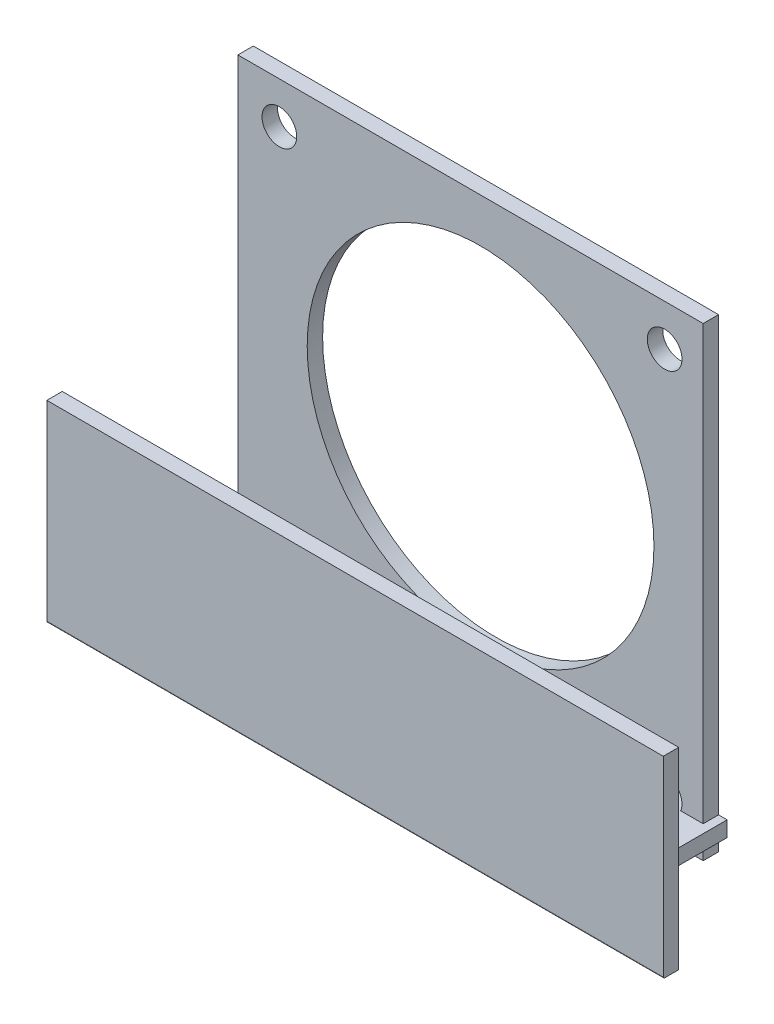
ISO-10303-21;
HEADER;
FILE_DESCRIPTION(('STEP AP214'),'2;1');
FILE_NAME('part.step','',(''),(''),'','','');
FILE_SCHEMA(('AUTOMOTIVE_DESIGN { 1 0 10303 214 1 1 1 1 }'));
ENDSEC;
DATA;
#1=APPLICATION_CONTEXT('core data for automotive mechanical design processes');
#2=APPLICATION_PROTOCOL_DEFINITION('international standard','automotive_design',2000,#1);
#3=PRODUCT_CONTEXT('',#1,'mechanical');
#4=PRODUCT('Part','Part','',(#3));
#5=PRODUCT_RELATED_PRODUCT_CATEGORY('part','',(#4));
#6=PRODUCT_DEFINITION_FORMATION('','',#4);
#7=PRODUCT_DEFINITION_CONTEXT('part definition',#1,'design');
#8=PRODUCT_DEFINITION('design','',#6,#7);
#9=PRODUCT_DEFINITION_SHAPE('','',#8);
#10=(LENGTH_UNIT() NAMED_UNIT(*) SI_UNIT(.MILLI.,.METRE.));
#11=(NAMED_UNIT(*) PLANE_ANGLE_UNIT() SI_UNIT($,.RADIAN.));
#12=(NAMED_UNIT(*) SI_UNIT($,.STERADIAN.) SOLID_ANGLE_UNIT());
#13=UNCERTAINTY_MEASURE_WITH_UNIT(LENGTH_MEASURE(1.E-05),#10,'distance_accuracy_value','');
#14=(GEOMETRIC_REPRESENTATION_CONTEXT(3) GLOBAL_UNCERTAINTY_ASSIGNED_CONTEXT((#13)) GLOBAL_UNIT_ASSIGNED_CONTEXT((#10,
#11,#12)) REPRESENTATION_CONTEXT('',''));
#15=CARTESIAN_POINT('',(0.,0.,0.));
#16=DIRECTION('',(0.,0.,1.));
#17=DIRECTION('',(1.,0.,0.));
#18=AXIS2_PLACEMENT_3D('',#15,#16,#17);
#19=CARTESIAN_POINT('',(4.97470104017416E-13,1.15730236722078E-12,18.0000000000003));
#20=DIRECTION('',(0.,0.,-1.));
#21=DIRECTION('',(0.,1.,0.));
#22=AXIS2_PLACEMENT_3D('',#19,#20,#21);
#23=PLANE('',#22);
#24=DIRECTION('',(0.,-1.,0.));
#25=VECTOR('',#24,1.);
#26=CARTESIAN_POINT('',(-38.2880449468926,-5.00000000000001,18.0000000000006));
#27=LINE('',#26,#25);
#28=CARTESIAN_POINT('',(-38.2880449468926,-5.00000000000001,18.0000000000006));
#29=VERTEX_POINT('',#28);
#30=CARTESIAN_POINT('',(-38.2880449468926,-30.,18.));
#31=VERTEX_POINT('',#30);
#32=EDGE_CURVE('E95',#29,#31,#27,.T.);
#33=ORIENTED_EDGE('',*,*,#32,.F.);
#34=DIRECTION('',(-1.,0.,0.));
#35=VECTOR('',#34,1.);
#36=CARTESIAN_POINT('',(41.7119550531074,-5.00000000000001,17.9999999999998));
#37=LINE('',#36,#35);
#38=CARTESIAN_POINT('',(41.7119550531074,-5.00000000000001,17.9999999999998));
#39=VERTEX_POINT('',#38);
#40=EDGE_CURVE('E114',#39,#29,#37,.T.);
#41=ORIENTED_EDGE('',*,*,#40,.F.);
#42=DIRECTION('',(0.,-1.,0.));
#43=VECTOR('',#42,1.);
#44=CARTESIAN_POINT('',(41.7119550531074,-5.00000000000001,17.9999999999998));
#45=LINE('',#44,#43);
#46=CARTESIAN_POINT('',(41.7119550531074,-30.,18.));
#47=VERTEX_POINT('',#46);
#48=EDGE_CURVE('E121',#39,#47,#45,.T.);
#49=ORIENTED_EDGE('',*,*,#48,.T.);
#50=DIRECTION('',(1.,0.,0.));
#51=VECTOR('',#50,1.);
#52=CARTESIAN_POINT('',(-38.2880449468926,-30.,18.));
#53=LINE('',#52,#51);
#54=EDGE_CURVE('E153',#31,#47,#53,.T.);
#55=ORIENTED_EDGE('',*,*,#54,.F.);
#56=EDGE_LOOP('',(#33,#41,#49,#55));
#57=FACE_BOUND('',#56,.T.);
#58=ADVANCED_FACE('F84',(#57),#23,.T.);
#59=CARTESIAN_POINT('',(4.97470104017416E-13,1.15730236722078E-12,20.0000000000003));
#60=DIRECTION('',(0.,0.,-1.));
#61=DIRECTION('',(0.,1.,0.));
#62=AXIS2_PLACEMENT_3D('',#59,#60,#61);
#63=PLANE('',#62);
#64=DIRECTION('',(0.,-1.,0.));
#65=VECTOR('',#64,1.);
#66=CARTESIAN_POINT('',(-38.2880449468926,-5.00000000000001,20.0000000000006));
#67=LINE('',#66,#65);
#68=CARTESIAN_POINT('',(-38.2880449468926,-5.00000000000001,20.0000000000006));
#69=VERTEX_POINT('',#68);
#70=CARTESIAN_POINT('',(-38.2880449468926,-29.8,20.0000000000022));
#71=VERTEX_POINT('',#70);
#72=EDGE_CURVE('E13',#69,#71,#67,.T.);
#73=ORIENTED_EDGE('',*,*,#72,.T.);
#74=DIRECTION('',(1.,0.,0.));
#75=VECTOR('',#74,1.);
#76=CARTESIAN_POINT('',(-38.2880449468926,-29.8,20.0000000000022));
#77=LINE('',#76,#75);
#78=CARTESIAN_POINT('',(41.7119550531074,-29.8,20.0000000000022));
#79=VERTEX_POINT('',#78);
#80=EDGE_CURVE('E148',#71,#79,#77,.T.);
#81=ORIENTED_EDGE('',*,*,#80,.T.);
#82=DIRECTION('',(0.,-1.,0.));
#83=VECTOR('',#82,1.);
#84=CARTESIAN_POINT('',(41.7119550531074,-5.00000000000001,19.9999999999998));
#85=LINE('',#84,#83);
#86=CARTESIAN_POINT('',(41.7119550531074,-5.00000000000001,19.9999999999998));
#87=VERTEX_POINT('',#86);
#88=EDGE_CURVE('E179',#87,#79,#85,.T.);
#89=ORIENTED_EDGE('',*,*,#88,.F.);
#90=DIRECTION('',(-1.,0.,0.));
#91=VECTOR('',#90,1.);
#92=CARTESIAN_POINT('',(41.7119550531074,-5.00000000000001,19.9999999999998));
#93=LINE('',#92,#91);
#94=EDGE_CURVE('E167',#87,#69,#93,.T.);
#95=ORIENTED_EDGE('',*,*,#94,.T.);
#96=EDGE_LOOP('',(#73,#81,#89,#95));
#97=FACE_BOUND('',#96,.T.);
#98=ADVANCED_FACE('F214',(#97),#63,.F.);
#99=CARTESIAN_POINT('',(41.7119550531074,-5.00000000000001,19.9999999999998));
#100=DIRECTION('',(0.,-1.,0.));
#101=DIRECTION('',(0.,0.,-1.));
#102=AXIS2_PLACEMENT_3D('',#99,#100,#101);
#103=PLANE('',#102);
#104=ORIENTED_EDGE('',*,*,#40,.T.);
#105=DIRECTION('',(0.,0.,-1.));
#106=VECTOR('',#105,1.);
#107=CARTESIAN_POINT('',(-38.2880449468926,-5.00000000000001,20.0000000000006));
#108=LINE('',#107,#106);
#109=EDGE_CURVE('E145',#69,#29,#108,.T.);
#110=ORIENTED_EDGE('',*,*,#109,.F.);
#111=ORIENTED_EDGE('',*,*,#94,.F.);
#112=DIRECTION('',(0.,0.,-1.));
#113=VECTOR('',#112,1.);
#114=CARTESIAN_POINT('',(41.7119550531074,-5.00000000000001,19.9999999999998));
#115=LINE('',#114,#113);
#116=EDGE_CURVE('E172',#87,#39,#115,.T.);
#117=ORIENTED_EDGE('',*,*,#116,.T.);
#118=EDGE_LOOP('',(#104,#110,#111,#117));
#119=FACE_BOUND('',#118,.T.);
#120=ADVANCED_FACE('F210',(#119),#103,.F.);
#121=CARTESIAN_POINT('',(-38.2880449468926,-5.00000000000001,20.0000000000006));
#122=DIRECTION('',(1.,0.,0.));
#123=DIRECTION('',(0.,1.,0.));
#124=AXIS2_PLACEMENT_3D('',#121,#122,#123);
#125=PLANE('',#124);
#126=ORIENTED_EDGE('',*,*,#32,.T.);
#127=DIRECTION('',(0.,0.,1.));
#128=VECTOR('',#127,1.);
#129=CARTESIAN_POINT('',(-38.2880449468926,-30.,20.0000000000006));
#130=LINE('',#129,#128);
#131=CARTESIAN_POINT('',(-38.2880449468926,-30.,19.8000000000005));
#132=VERTEX_POINT('',#131);
#133=EDGE_CURVE('E144',#31,#132,#130,.T.);
#134=ORIENTED_EDGE('',*,*,#133,.T.);
#135=CARTESIAN_POINT('',(-38.2880449468926,-29.8,19.8000000000022));
#136=DIRECTION('',(1.,0.,0.));
#137=DIRECTION('',(0.,0.,1.));
#138=AXIS2_PLACEMENT_3D('',#135,#136,#137);
#139=CIRCLE('',#138,0.200000000000006);
#140=EDGE_CURVE('E128',#71,#132,#139,.T.);
#141=ORIENTED_EDGE('',*,*,#140,.F.);
#142=ORIENTED_EDGE('',*,*,#72,.F.);
#143=ORIENTED_EDGE('',*,*,#109,.T.);
#144=EDGE_LOOP('',(#126,#134,#141,#142,#143));
#145=FACE_BOUND('',#144,.T.);
#146=ADVANCED_FACE('F143',(#145),#125,.F.);
#147=CARTESIAN_POINT('',(41.7119550531074,-5.00000000000001,19.9999999999998));
#148=DIRECTION('',(1.,0.,0.));
#149=DIRECTION('',(0.,1.,0.));
#150=AXIS2_PLACEMENT_3D('',#147,#148,#149);
#151=PLANE('',#150);
#152=ORIENTED_EDGE('',*,*,#48,.F.);
#153=ORIENTED_EDGE('',*,*,#116,.F.);
#154=ORIENTED_EDGE('',*,*,#88,.T.);
#155=CARTESIAN_POINT('',(41.7119550531074,-29.8,20.0000000000013));
#156=CARTESIAN_POINT('',(41.7119550531074,-29.8036316842867,20.0000000000013));
#157=CARTESIAN_POINT('',(41.7119550531074,-29.8078519631519,19.9998458072495));
#158=CARTESIAN_POINT('',(41.7119550531074,-29.8131905695688,19.9996507551117));
#159=CARTESIAN_POINT('',(41.7119550531074,-29.819603428066,19.9990369453358));
#160=CARTESIAN_POINT('',(41.7119550531074,-29.8288365635284,19.9981531914197));
#161=CARTESIAN_POINT('',(41.7119550531074,-29.8390180644034,19.9961570560819));
#162=CARTESIAN_POINT('',(41.7119550531074,-29.8495002266089,19.994101974552));
#163=CARTESIAN_POINT('',(41.7119550531074,-29.8607353490222,19.9905550245458));
#164=CARTESIAN_POINT('',(41.7119550531074,-29.8682401553564,19.9881857425839));
#165=CARTESIAN_POINT('',(41.7119550531074,-29.8765366864734,19.9847759065034));
#166=CARTESIAN_POINT('',(41.7119550531074,-29.8864165103534,19.980715344389));
#167=CARTESIAN_POINT('',(41.7119550531074,-29.8967437774215,19.9750446843828));
#168=CARTESIAN_POINT('',(41.7119550531074,-29.9036421570255,19.971256812425));
#169=CARTESIAN_POINT('',(41.7119550531074,-29.9111140466044,19.9662939224615));
#170=CARTESIAN_POINT('',(41.7119550531074,-29.9200118560688,19.960383924887));
#171=CARTESIAN_POINT('',(41.7119550531074,-29.929034396709,19.9528074751652));
#172=CARTESIAN_POINT('',(41.7119550531074,-29.9350612487233,19.9477465790065));
#173=CARTESIAN_POINT('',(41.7119550531074,-29.9414213562379,19.941421356238));
#174=CARTESIAN_POINT('',(41.7119550531074,-29.9489952134583,19.9338890410963));
#175=CARTESIAN_POINT('',(41.7119550531074,-29.9563662964942,19.9246979603723));
#176=CARTESIAN_POINT('',(41.7119550531074,-29.9612900123756,19.9185585274141));
#177=CARTESIAN_POINT('',(41.7119550531074,-29.9662939224611,19.9111140466044));
#178=CARTESIAN_POINT('',(41.7119550531074,-29.9722527683522,19.9022488765419));
#179=CARTESIAN_POINT('',(41.7119550531074,-29.9776891271963,19.8917963728938));
#180=CARTESIAN_POINT('',(41.7119550531074,-29.9813204913047,19.8848143381018));
#181=CARTESIAN_POINT('',(41.7119550531074,-29.9847759065027,19.8765366864732));
#182=CARTESIAN_POINT('',(41.7119550531074,-29.9888907459586,19.8666793450042));
#183=CARTESIAN_POINT('',(41.7119550531074,-29.9921834643894,19.855367102285));
#184=CARTESIAN_POINT('',(41.7119550531074,-29.9943829254389,19.8478107813402));
#185=CARTESIAN_POINT('',(41.7119550531074,-29.9961570560809,19.8390180644031));
#186=CARTESIAN_POINT('',(41.7119550531074,-29.9979915940595,19.8299259644339));
#187=CARTESIAN_POINT('',(41.7119550531074,-29.9990369453346,19.8196034280657));
#188=CARTESIAN_POINT('',(41.7119550531074,-30.,19.8100935465121));
#189=CARTESIAN_POINT('',(41.7119550531074,-30.,19.7999999999996));
#190=B_SPLINE_CURVE_WITH_KNOTS('',2,(#155,#156,#157,#158,#159,#160,#161,#162,#163,#164,#165,
#166,#167,#168,#169,#170,#171,#172,#173,#174,#175,#176,#177,#178,#179,#180,#181,#182,#183,#184,
#185,#186,#187,#188,#189),.UNSPECIFIED.,.F.,.F.,(3,2,2,2,2,2,2,2,2,2,2,2,2,2,2,2,2,3),(0.,0.025,
0.0625,0.125,0.196428571428571,0.25,0.321428571428571,0.375,0.446428571428571,0.5,
0.571428571428571,0.625,0.696428571428571,0.75,0.821428571428571,0.875,0.9375,1.),.UNSPECIFIED.);
#191=CARTESIAN_POINT('',(41.7119550531074,-30.,19.8000000000005));
#192=VERTEX_POINT('',#191);
#193=EDGE_CURVE('E157',#79,#192,#190,.T.);
#194=ORIENTED_EDGE('',*,*,#193,.T.);
#195=DIRECTION('',(0.,0.,1.));
#196=VECTOR('',#195,1.);
#197=CARTESIAN_POINT('',(41.7119550531074,-30.,20.0000000000006));
#198=LINE('',#197,#196);
#199=EDGE_CURVE('E155',#47,#192,#198,.T.);
#200=ORIENTED_EDGE('',*,*,#199,.F.);
#201=EDGE_LOOP('',(#152,#153,#154,#194,#200));
#202=FACE_BOUND('',#201,.T.);
#203=ADVANCED_FACE('F201',(#202),#151,.T.);
#204=CARTESIAN_POINT('',(-38.2880449468926,-30.,20.0000000000006));
#205=DIRECTION('',(0.,1.,0.));
#206=DIRECTION('',(-1.,0.,0.));
#207=AXIS2_PLACEMENT_3D('',#204,#205,#206);
#208=PLANE('',#207);
#209=ORIENTED_EDGE('',*,*,#199,.T.);
#210=DIRECTION('',(1.,0.,0.));
#211=VECTOR('',#210,1.);
#212=CARTESIAN_POINT('',(-38.2880449468926,-30.,19.8000000000005));
#213=LINE('',#212,#211);
#214=EDGE_CURVE('E154',#132,#192,#213,.T.);
#215=ORIENTED_EDGE('',*,*,#214,.F.);
#216=ORIENTED_EDGE('',*,*,#133,.F.);
#217=ORIENTED_EDGE('',*,*,#54,.T.);
#218=EDGE_LOOP('',(#209,#215,#216,#217));
#219=FACE_BOUND('',#218,.T.);
#220=ADVANCED_FACE('F152',(#219),#208,.F.);
#221=CARTESIAN_POINT('',(-38.2880449468926,-29.8,19.8000000000022));
#222=DIRECTION('',(1.,0.,0.));
#223=DIRECTION('',(0.,1.,0.));
#224=AXIS2_PLACEMENT_3D('',#221,#222,#223);
#225=CYLINDRICAL_SURFACE('',#224,0.200000000000007);
#226=ORIENTED_EDGE('',*,*,#193,.F.);
#227=ORIENTED_EDGE('',*,*,#80,.F.);
#228=ORIENTED_EDGE('',*,*,#140,.T.);
#229=ORIENTED_EDGE('',*,*,#214,.T.);
#230=EDGE_LOOP('',(#226,#227,#228,#229));
#231=FACE_BOUND('',#230,.T.);
#232=ADVANCED_FACE('F221',(#231),#225,.T.);
#233=CLOSED_SHELL('',(#58,#98,#120,#146,#203,#220,#232));
#234=MANIFOLD_SOLID_BREP('B2',#233);
#235=CARTESIAN_POINT('',(28.8875813983369,28.2207746137664,2.));
#236=DIRECTION('',(-1.,0.,0.));
#237=DIRECTION('',(0.,-1.,0.));
#238=AXIS2_PLACEMENT_3D('',#235,#236,#237);
#239=PLANE('',#238);
#240=DIRECTION('',(0.,0.,-1.));
#241=VECTOR('',#240,1.);
#242=CARTESIAN_POINT('',(28.8875813983369,-30.,2.));
#243=LINE('',#242,#241);
#244=CARTESIAN_POINT('',(28.8875813983369,-30.,2.));
#245=VERTEX_POINT('',#244);
#246=CARTESIAN_POINT('',(28.8875813983369,-30.,0.));
#247=VERTEX_POINT('',#246);
#248=EDGE_CURVE('E82',#245,#247,#243,.T.);
#249=ORIENTED_EDGE('',*,*,#248,.F.);
#250=DIRECTION('',(0.,1.,0.));
#251=VECTOR('',#250,1.);
#252=CARTESIAN_POINT('',(28.8875813983369,28.2207746137664,2.));
#253=LINE('',#252,#251);
#254=CARTESIAN_POINT('',(28.8875813983369,-32.1600265343079,2.));
#255=VERTEX_POINT('',#254);
#256=EDGE_CURVE('E508',#255,#245,#253,.T.);
#257=ORIENTED_EDGE('',*,*,#256,.F.);
#258=DIRECTION('',(0.,0.,-1.));
#259=VECTOR('',#258,1.);
#260=CARTESIAN_POINT('',(28.8875813983369,-32.1600265343079,2.));
#261=LINE('',#260,#259);
#262=CARTESIAN_POINT('',(28.8875813983369,-32.1600265343079,0.));
#263=VERTEX_POINT('',#262);
#264=EDGE_CURVE('E517',#255,#263,#261,.T.);
#265=ORIENTED_EDGE('',*,*,#264,.T.);
#266=DIRECTION('',(0.,1.,0.));
#267=VECTOR('',#266,1.);
#268=CARTESIAN_POINT('',(28.8875813983369,28.2207746137664,0.));
#269=LINE('',#268,#267);
#270=EDGE_CURVE('E518',#263,#247,#269,.T.);
#271=ORIENTED_EDGE('',*,*,#270,.T.);
#272=EDGE_LOOP('',(#249,#257,#265,#271));
#273=FACE_BOUND('',#272,.T.);
#274=ADVANCED_FACE('F321',(#273),#239,.F.);
#275=CARTESIAN_POINT('',(0.,0.,2.));
#276=DIRECTION('',(0.,0.,1.));
#277=DIRECTION('',(1.,0.,0.));
#278=AXIS2_PLACEMENT_3D('',#275,#276,#277);
#279=PLANE('',#278);
#280=DIRECTION('',(-1.,0.,0.));
#281=VECTOR('',#280,1.);
#282=CARTESIAN_POINT('',(0.,-28.,2.));
#283=LINE('',#282,#281);
#284=CARTESIAN_POINT('',(28.8875813983369,-28.,2.));
#285=VERTEX_POINT('',#284);
#286=CARTESIAN_POINT('',(25.9749109307618,-28.,2.));
#287=VERTEX_POINT('',#286);
#288=EDGE_CURVE('E469',#285,#287,#283,.T.);
#289=ORIENTED_EDGE('',*,*,#288,.F.);
#290=CARTESIAN_POINT('',(28.8875813983369,28.2207746137664,2.));
#291=VERTEX_POINT('',#290);
#292=EDGE_CURVE('E511',#285,#291,#253,.T.);
#293=ORIENTED_EDGE('',*,*,#292,.T.);
#294=DIRECTION('',(-1.,0.,0.));
#295=VECTOR('',#294,1.);
#296=CARTESIAN_POINT('',(-31.4932197497373,28.2207746137664,2.));
#297=LINE('',#296,#295);
#298=CARTESIAN_POINT('',(-31.4932197497373,28.2207746137664,2.));
#299=VERTEX_POINT('',#298);
#300=EDGE_CURVE('E510',#291,#299,#297,.T.);
#301=ORIENTED_EDGE('',*,*,#300,.T.);
#302=DIRECTION('',(0.,-1.,0.));
#303=VECTOR('',#302,1.);
#304=CARTESIAN_POINT('',(-31.4932197497373,28.2207746137664,2.));
#305=LINE('',#304,#303);
#306=CARTESIAN_POINT('',(-31.4932197497373,-32.1600265343079,2.));
#307=VERTEX_POINT('',#306);
#308=EDGE_CURVE('E513',#299,#307,#305,.T.);
#309=ORIENTED_EDGE('',*,*,#308,.T.);
#310=DIRECTION('',(1.,0.,0.));
#311=VECTOR('',#310,1.);
#312=CARTESIAN_POINT('',(-31.4932197497373,-32.1600265343079,2.));
#313=LINE('',#312,#311);
#314=EDGE_CURVE('E515',#307,#255,#313,.T.);
#315=ORIENTED_EDGE('',*,*,#314,.T.);
#316=ORIENTED_EDGE('',*,*,#256,.T.);
#317=DIRECTION('',(-1.,0.,0.));
#318=VECTOR('',#317,1.);
#319=CARTESIAN_POINT('',(0.,-30.,2.));
#320=LINE('',#319,#318);
#321=CARTESIAN_POINT('',(-30.,-30.,2.));
#322=VERTEX_POINT('',#321);
#323=EDGE_CURVE('E341',#245,#322,#320,.T.);
#324=ORIENTED_EDGE('',*,*,#323,.T.);
#325=DIRECTION('',(0.,-1.,0.));
#326=VECTOR('',#325,1.);
#327=CARTESIAN_POINT('',(-30.,0.,2.));
#328=LINE('',#327,#326);
#329=CARTESIAN_POINT('',(-30.,-28.,2.));
#330=VERTEX_POINT('',#329);
#331=EDGE_CURVE('E336',#330,#322,#328,.T.);
#332=ORIENTED_EDGE('',*,*,#331,.F.);
#333=CARTESIAN_POINT('',(-28.199748134088,-28.,2.));
#334=VERTEX_POINT('',#333);
#335=EDGE_CURVE('E468',#334,#330,#283,.T.);
#336=ORIENTED_EDGE('',*,*,#335,.F.);
#337=CARTESIAN_POINT('',(-26.1124186016631,-27.1600265343079,2.));
#338=DIRECTION('',(0.,0.,1.));
#339=DIRECTION('',(1.,0.,0.));
#340=AXIS2_PLACEMENT_3D('',#337,#338,#339);
#341=CIRCLE('',#340,2.25);
#342=CARTESIAN_POINT('',(-24.0250890692382,-28.,2.));
#343=VERTEX_POINT('',#342);
#344=EDGE_CURVE('E490',#343,#334,#341,.T.);
#345=ORIENTED_EDGE('',*,*,#344,.F.);
#346=CARTESIAN_POINT('',(21.800251865912,-28.,2.));
#347=VERTEX_POINT('',#346);
#348=EDGE_CURVE('E463',#347,#343,#283,.T.);
#349=ORIENTED_EDGE('',*,*,#348,.F.);
#350=CARTESIAN_POINT('',(23.8875813983369,-27.1600265343079,2.));
#351=DIRECTION('',(0.,0.,1.));
#352=DIRECTION('',(-1.,0.,0.));
#353=AXIS2_PLACEMENT_3D('',#350,#351,#352);
#354=CIRCLE('',#353,2.25);
#355=EDGE_CURVE('E485',#287,#347,#354,.T.);
#356=ORIENTED_EDGE('',*,*,#355,.F.);
#357=EDGE_LOOP('',(#289,#293,#301,#309,#315,#316,#324,#332,#336,#345,#349,#356));
#358=FACE_BOUND('',#357,.T.);
#359=CARTESIAN_POINT('',(0.,0.,2.));
#360=DIRECTION('',(0.,0.,1.));
#361=DIRECTION('',(1.,0.,0.));
#362=AXIS2_PLACEMENT_3D('',#359,#360,#361);
#363=CIRCLE('',#362,22.5);
#364=CARTESIAN_POINT('',(22.5,0.,2.));
#365=VERTEX_POINT('',#364);
#366=EDGE_CURVE('E478',#365,#365,#363,.T.);
#367=ORIENTED_EDGE('',*,*,#366,.F.);
#368=EDGE_LOOP('',(#367));
#369=FACE_BOUND('',#368,.T.);
#370=CARTESIAN_POINT('',(23.8875813983369,22.8399734656921,2.));
#371=DIRECTION('',(0.,0.,1.));
#372=DIRECTION('',(1.,0.,0.));
#373=AXIS2_PLACEMENT_3D('',#370,#371,#372);
#374=CIRCLE('',#373,2.25);
#375=CARTESIAN_POINT('',(26.1375813983369,22.8399734656921,2.));
#376=VERTEX_POINT('',#375);
#377=EDGE_CURVE('E502',#376,#376,#374,.T.);
#378=ORIENTED_EDGE('',*,*,#377,.F.);
#379=EDGE_LOOP('',(#378));
#380=FACE_BOUND('',#379,.T.);
#381=CARTESIAN_POINT('',(-26.1124186016631,22.8399734656921,2.));
#382=DIRECTION('',(0.,0.,1.));
#383=DIRECTION('',(-1.,0.,0.));
#384=AXIS2_PLACEMENT_3D('',#381,#382,#383);
#385=CIRCLE('',#384,2.25);
#386=CARTESIAN_POINT('',(-28.3624186016631,22.8399734656921,2.));
#387=VERTEX_POINT('',#386);
#388=EDGE_CURVE('E496',#387,#387,#385,.T.);
#389=ORIENTED_EDGE('',*,*,#388,.F.);
#390=EDGE_LOOP('',(#389));
#391=FACE_BOUND('',#390,.T.);
#392=ADVANCED_FACE('F556',(#358,#369,#380,#391),#279,.T.);
#393=CARTESIAN_POINT('',(0.,0.,0.));
#394=DIRECTION('',(0.,0.,1.));
#395=DIRECTION('',(1.,0.,0.));
#396=AXIS2_PLACEMENT_3D('',#393,#394,#395);
#397=PLANE('',#396);
#398=DIRECTION('',(1.,0.,0.));
#399=VECTOR('',#398,1.);
#400=CARTESIAN_POINT('',(-30.,-28.,0.));
#401=LINE('',#400,#399);
#402=CARTESIAN_POINT('',(21.800251865912,-28.,0.));
#403=VERTEX_POINT('',#402);
#404=CARTESIAN_POINT('',(25.9749109307618,-28.,0.));
#405=VERTEX_POINT('',#404);
#406=EDGE_CURVE('E456',#403,#405,#401,.T.);
#407=ORIENTED_EDGE('',*,*,#406,.T.);
#408=CARTESIAN_POINT('',(23.8875813983369,-27.1600265343079,0.));
#409=DIRECTION('',(0.,0.,1.));
#410=DIRECTION('',(-1.,0.,0.));
#411=AXIS2_PLACEMENT_3D('',#408,#409,#410);
#412=CIRCLE('',#411,2.25);
#413=EDGE_CURVE('E482',#405,#403,#412,.T.);
#414=ORIENTED_EDGE('',*,*,#413,.T.);
#415=EDGE_LOOP('',(#407,#414));
#416=FACE_BOUND('',#415,.T.);
#417=CARTESIAN_POINT('',(-28.199748134088,-28.,0.));
#418=VERTEX_POINT('',#417);
#419=CARTESIAN_POINT('',(-24.0250890692382,-28.,0.));
#420=VERTEX_POINT('',#419);
#421=EDGE_CURVE('E432',#418,#420,#401,.T.);
#422=ORIENTED_EDGE('',*,*,#421,.T.);
#423=CARTESIAN_POINT('',(-26.1124186016631,-27.1600265343079,0.));
#424=DIRECTION('',(0.,0.,1.));
#425=DIRECTION('',(1.,0.,0.));
#426=AXIS2_PLACEMENT_3D('',#423,#424,#425);
#427=CIRCLE('',#426,2.25);
#428=EDGE_CURVE('E487',#420,#418,#427,.T.);
#429=ORIENTED_EDGE('',*,*,#428,.T.);
#430=EDGE_LOOP('',(#422,#429));
#431=FACE_BOUND('',#430,.T.);
#432=CARTESIAN_POINT('',(0.,0.,0.));
#433=DIRECTION('',(0.,0.,1.));
#434=DIRECTION('',(1.,0.,0.));
#435=AXIS2_PLACEMENT_3D('',#432,#433,#434);
#436=CIRCLE('',#435,22.5);
#437=CARTESIAN_POINT('',(22.5,0.,0.));
#438=VERTEX_POINT('',#437);
#439=EDGE_CURVE('E479',#438,#438,#436,.T.);
#440=ORIENTED_EDGE('',*,*,#439,.T.);
#441=EDGE_LOOP('',(#440));
#442=FACE_BOUND('',#441,.T.);
#443=CARTESIAN_POINT('',(23.8875813983369,22.8399734656921,0.));
#444=DIRECTION('',(0.,0.,1.));
#445=DIRECTION('',(1.,0.,0.));
#446=AXIS2_PLACEMENT_3D('',#443,#444,#445);
#447=CIRCLE('',#446,2.25);
#448=CARTESIAN_POINT('',(26.1375813983369,22.8399734656921,0.));
#449=VERTEX_POINT('',#448);
#450=EDGE_CURVE('E499',#449,#449,#447,.T.);
#451=ORIENTED_EDGE('',*,*,#450,.T.);
#452=EDGE_LOOP('',(#451));
#453=FACE_BOUND('',#452,.T.);
#454=CARTESIAN_POINT('',(-26.1124186016631,22.8399734656921,0.));
#455=DIRECTION('',(0.,0.,1.));
#456=DIRECTION('',(-1.,0.,0.));
#457=AXIS2_PLACEMENT_3D('',#454,#455,#456);
#458=CIRCLE('',#457,2.25);
#459=CARTESIAN_POINT('',(-28.3624186016631,22.8399734656921,0.));
#460=VERTEX_POINT('',#459);
#461=EDGE_CURVE('E493',#460,#460,#458,.T.);
#462=ORIENTED_EDGE('',*,*,#461,.T.);
#463=EDGE_LOOP('',(#462));
#464=FACE_BOUND('',#463,.T.);
#465=CARTESIAN_POINT('',(28.8875813983369,-28.,0.));
#466=VERTEX_POINT('',#465);
#467=CARTESIAN_POINT('',(28.8875813983369,28.2207746137664,0.));
#468=VERTEX_POINT('',#467);
#469=EDGE_CURVE('E505',#466,#468,#269,.T.);
#470=ORIENTED_EDGE('',*,*,#469,.F.);
#471=CARTESIAN_POINT('',(30.,-28.,0.));
#472=VERTEX_POINT('',#471);
#473=EDGE_CURVE('E454',#466,#472,#401,.T.);
#474=ORIENTED_EDGE('',*,*,#473,.T.);
#475=DIRECTION('',(0.,-1.,0.));
#476=VECTOR('',#475,1.);
#477=CARTESIAN_POINT('',(30.,-28.,0.));
#478=LINE('',#477,#476);
#479=CARTESIAN_POINT('',(30.,-30.,0.));
#480=VERTEX_POINT('',#479);
#481=EDGE_CURVE('E447',#472,#480,#478,.T.);
#482=ORIENTED_EDGE('',*,*,#481,.T.);
#483=DIRECTION('',(1.,0.,0.));
#484=VECTOR('',#483,1.);
#485=CARTESIAN_POINT('',(-30.,-30.,0.));
#486=LINE('',#485,#484);
#487=EDGE_CURVE('E448',#247,#480,#486,.T.);
#488=ORIENTED_EDGE('',*,*,#487,.F.);
#489=ORIENTED_EDGE('',*,*,#270,.F.);
#490=DIRECTION('',(1.,0.,0.));
#491=VECTOR('',#490,1.);
#492=CARTESIAN_POINT('',(-31.4932197497373,-32.1600265343079,0.));
#493=LINE('',#492,#491);
#494=CARTESIAN_POINT('',(-31.4932197497373,-32.1600265343079,0.));
#495=VERTEX_POINT('',#494);
#496=EDGE_CURVE('E524',#495,#263,#493,.T.);
#497=ORIENTED_EDGE('',*,*,#496,.F.);
#498=DIRECTION('',(0.,-1.,0.));
#499=VECTOR('',#498,1.);
#500=CARTESIAN_POINT('',(-31.4932197497373,28.2207746137664,0.));
#501=LINE('',#500,#499);
#502=CARTESIAN_POINT('',(-31.4932197497373,28.2207746137664,0.));
#503=VERTEX_POINT('',#502);
#504=EDGE_CURVE('E522',#503,#495,#501,.T.);
#505=ORIENTED_EDGE('',*,*,#504,.F.);
#506=DIRECTION('',(-1.,0.,0.));
#507=VECTOR('',#506,1.);
#508=CARTESIAN_POINT('',(-31.4932197497373,28.2207746137664,0.));
#509=LINE('',#508,#507);
#510=EDGE_CURVE('E520',#468,#503,#509,.T.);
#511=ORIENTED_EDGE('',*,*,#510,.F.);
#512=EDGE_LOOP('',(#470,#474,#482,#488,#489,#497,#505,#511));
#513=FACE_BOUND('',#512,.T.);
#514=ADVANCED_FACE('F547',(#416,#431,#442,#453,#464,#513),#397,.F.);
#515=ORIENTED_EDGE('',*,*,#292,.F.);
#516=DIRECTION('',(0.,0.,-1.));
#517=VECTOR('',#516,1.);
#518=CARTESIAN_POINT('',(28.8875813983369,-28.,2.));
#519=LINE('',#518,#517);
#520=EDGE_CURVE('E472',#285,#466,#519,.T.);
#521=ORIENTED_EDGE('',*,*,#520,.T.);
#522=ORIENTED_EDGE('',*,*,#469,.T.);
#523=DIRECTION('',(0.,0.,-1.));
#524=VECTOR('',#523,1.);
#525=CARTESIAN_POINT('',(28.8875813983369,28.2207746137664,2.));
#526=LINE('',#525,#524);
#527=EDGE_CURVE('E534',#291,#468,#526,.T.);
#528=ORIENTED_EDGE('',*,*,#527,.F.);
#529=EDGE_LOOP('',(#515,#521,#522,#528));
#530=FACE_BOUND('',#529,.T.);
#531=ADVANCED_FACE('F323',(#530),#239,.F.);
#532=CARTESIAN_POINT('',(-31.4932197497373,28.2207746137664,2.));
#533=DIRECTION('',(0.,-1.,0.));
#534=DIRECTION('',(1.,0.,0.));
#535=AXIS2_PLACEMENT_3D('',#532,#533,#534);
#536=PLANE('',#535);
#537=ORIENTED_EDGE('',*,*,#510,.T.);
#538=DIRECTION('',(0.,0.,-1.));
#539=VECTOR('',#538,1.);
#540=CARTESIAN_POINT('',(-31.4932197497373,28.2207746137664,2.));
#541=LINE('',#540,#539);
#542=EDGE_CURVE('E531',#299,#503,#541,.T.);
#543=ORIENTED_EDGE('',*,*,#542,.F.);
#544=ORIENTED_EDGE('',*,*,#300,.F.);
#545=ORIENTED_EDGE('',*,*,#527,.T.);
#546=EDGE_LOOP('',(#537,#543,#544,#545));
#547=FACE_BOUND('',#546,.T.);
#548=ADVANCED_FACE('F574',(#547),#536,.F.);
#549=CARTESIAN_POINT('',(-31.4932197497373,28.2207746137664,2.));
#550=DIRECTION('',(1.,0.,0.));
#551=DIRECTION('',(0.,0.,-1.));
#552=AXIS2_PLACEMENT_3D('',#549,#550,#551);
#553=PLANE('',#552);
#554=ORIENTED_EDGE('',*,*,#504,.T.);
#555=DIRECTION('',(0.,0.,-1.));
#556=VECTOR('',#555,1.);
#557=CARTESIAN_POINT('',(-31.4932197497373,-32.1600265343079,2.));
#558=LINE('',#557,#556);
#559=EDGE_CURVE('E528',#307,#495,#558,.T.);
#560=ORIENTED_EDGE('',*,*,#559,.F.);
#561=ORIENTED_EDGE('',*,*,#308,.F.);
#562=ORIENTED_EDGE('',*,*,#542,.T.);
#563=EDGE_LOOP('',(#554,#560,#561,#562));
#564=FACE_BOUND('',#563,.T.);
#565=ADVANCED_FACE('F579',(#564),#553,.F.);
#566=CARTESIAN_POINT('',(-31.4932197497373,-32.1600265343079,2.));
#567=DIRECTION('',(0.,1.,0.));
#568=DIRECTION('',(0.,0.,1.));
#569=AXIS2_PLACEMENT_3D('',#566,#567,#568);
#570=PLANE('',#569);
#571=ORIENTED_EDGE('',*,*,#496,.T.);
#572=ORIENTED_EDGE('',*,*,#264,.F.);
#573=ORIENTED_EDGE('',*,*,#314,.F.);
#574=ORIENTED_EDGE('',*,*,#559,.T.);
#575=EDGE_LOOP('',(#571,#572,#573,#574));
#576=FACE_BOUND('',#575,.T.);
#577=ADVANCED_FACE('F584',(#576),#570,.F.);
#578=CARTESIAN_POINT('',(23.8875813983369,22.8399734656921,2.));
#579=DIRECTION('',(0.,0.,-1.));
#580=DIRECTION('',(-1.,0.,0.));
#581=AXIS2_PLACEMENT_3D('',#578,#579,#580);
#582=CYLINDRICAL_SURFACE('',#581,2.25);
#583=ORIENTED_EDGE('',*,*,#377,.T.);
#584=EDGE_LOOP('',(#583));
#585=FACE_BOUND('',#584,.T.);
#586=ORIENTED_EDGE('',*,*,#450,.F.);
#587=EDGE_LOOP('',(#586));
#588=FACE_BOUND('',#587,.T.);
#589=ADVANCED_FACE('F604',(#585,#588),#582,.F.);
#590=CARTESIAN_POINT('',(-26.1124186016631,22.8399734656921,2.));
#591=DIRECTION('',(0.,0.,-1.));
#592=DIRECTION('',(-1.,0.,0.));
#593=AXIS2_PLACEMENT_3D('',#590,#591,#592);
#594=CYLINDRICAL_SURFACE('',#593,2.25);
#595=ORIENTED_EDGE('',*,*,#388,.T.);
#596=EDGE_LOOP('',(#595));
#597=FACE_BOUND('',#596,.T.);
#598=ORIENTED_EDGE('',*,*,#461,.F.);
#599=EDGE_LOOP('',(#598));
#600=FACE_BOUND('',#599,.T.);
#601=ADVANCED_FACE('F620',(#597,#600),#594,.F.);
#602=CARTESIAN_POINT('',(-26.1124186016631,-27.1600265343079,2.));
#603=DIRECTION('',(0.,0.,-1.));
#604=DIRECTION('',(-1.,0.,0.));
#605=AXIS2_PLACEMENT_3D('',#602,#603,#604);
#606=CYLINDRICAL_SURFACE('',#605,2.25);
#607=DIRECTION('',(0.,0.,-1.));
#608=VECTOR('',#607,1.);
#609=CARTESIAN_POINT('',(-24.0250890692382,-28.,2.));
#610=LINE('',#609,#608);
#611=EDGE_CURVE('E467',#343,#420,#610,.T.);
#612=ORIENTED_EDGE('',*,*,#611,.F.);
#613=ORIENTED_EDGE('',*,*,#344,.T.);
#614=DIRECTION('',(0.,0.,-1.));
#615=VECTOR('',#614,1.);
#616=CARTESIAN_POINT('',(-28.199748134088,-28.,2.));
#617=LINE('',#616,#615);
#618=EDGE_CURVE('E474',#418,#334,#617,.F.);
#619=ORIENTED_EDGE('',*,*,#618,.F.);
#620=ORIENTED_EDGE('',*,*,#428,.F.);
#621=EDGE_LOOP('',(#612,#613,#619,#620));
#622=FACE_BOUND('',#621,.T.);
#623=ADVANCED_FACE('F555',(#622),#606,.F.);
#624=CARTESIAN_POINT('',(23.8875813983369,-27.1600265343079,2.));
#625=DIRECTION('',(0.,0.,-1.));
#626=DIRECTION('',(-1.,0.,0.));
#627=AXIS2_PLACEMENT_3D('',#624,#625,#626);
#628=CYLINDRICAL_SURFACE('',#627,2.25);
#629=DIRECTION('',(0.,0.,-1.));
#630=VECTOR('',#629,1.);
#631=CARTESIAN_POINT('',(25.9749109307618,-28.,2.));
#632=LINE('',#631,#630);
#633=EDGE_CURVE('E329',#287,#405,#632,.T.);
#634=ORIENTED_EDGE('',*,*,#633,.F.);
#635=ORIENTED_EDGE('',*,*,#355,.T.);
#636=DIRECTION('',(0.,0.,-1.));
#637=VECTOR('',#636,1.);
#638=CARTESIAN_POINT('',(21.800251865912,-28.,2.));
#639=LINE('',#638,#637);
#640=EDGE_CURVE('E537',#403,#347,#639,.F.);
#641=ORIENTED_EDGE('',*,*,#640,.F.);
#642=ORIENTED_EDGE('',*,*,#413,.F.);
#643=EDGE_LOOP('',(#634,#635,#641,#642));
#644=FACE_BOUND('',#643,.T.);
#645=ADVANCED_FACE('F635',(#644),#628,.F.);
#646=CARTESIAN_POINT('',(0.,0.,0.));
#647=DIRECTION('',(0.,0.,1.));
#648=DIRECTION('',(1.,0.,0.));
#649=AXIS2_PLACEMENT_3D('',#646,#647,#648);
#650=CYLINDRICAL_SURFACE('',#649,22.5);
#651=ORIENTED_EDGE('',*,*,#439,.F.);
#652=EDGE_LOOP('',(#651));
#653=FACE_BOUND('',#652,.T.);
#654=ORIENTED_EDGE('',*,*,#366,.T.);
#655=EDGE_LOOP('',(#654));
#656=FACE_BOUND('',#655,.T.);
#657=ADVANCED_FACE('F642',(#653,#656),#650,.F.);
#658=CARTESIAN_POINT('',(0.,-28.,0.));
#659=DIRECTION('',(0.,1.,0.));
#660=DIRECTION('',(0.,0.,1.));
#661=AXIS2_PLACEMENT_3D('',#658,#659,#660);
#662=PLANE('',#661);
#663=ORIENTED_EDGE('',*,*,#618,.T.);
#664=ORIENTED_EDGE('',*,*,#335,.T.);
#665=DIRECTION('',(0.,0.,-1.));
#666=VECTOR('',#665,1.);
#667=CARTESIAN_POINT('',(-30.,-28.,0.));
#668=LINE('',#667,#666);
#669=CARTESIAN_POINT('',(-30.,-28.,14.));
#670=VERTEX_POINT('',#669);
#671=EDGE_CURVE('E442',#670,#330,#668,.T.);
#672=ORIENTED_EDGE('',*,*,#671,.F.);
#673=DIRECTION('',(-1.,0.,0.));
#674=VECTOR('',#673,1.);
#675=CARTESIAN_POINT('',(-30.,-28.,14.));
#676=LINE('',#675,#674);
#677=CARTESIAN_POINT('',(30.,-28.,14.));
#678=VERTEX_POINT('',#677);
#679=EDGE_CURVE('E424',#678,#670,#676,.T.);
#680=ORIENTED_EDGE('',*,*,#679,.F.);
#681=DIRECTION('',(0.,0.,1.));
#682=VECTOR('',#681,1.);
#683=CARTESIAN_POINT('',(30.,-28.,0.));
#684=LINE('',#683,#682);
#685=EDGE_CURVE('E440',#472,#678,#684,.T.);
#686=ORIENTED_EDGE('',*,*,#685,.F.);
#687=ORIENTED_EDGE('',*,*,#473,.F.);
#688=ORIENTED_EDGE('',*,*,#520,.F.);
#689=ORIENTED_EDGE('',*,*,#288,.T.);
#690=ORIENTED_EDGE('',*,*,#633,.T.);
#691=ORIENTED_EDGE('',*,*,#406,.F.);
#692=ORIENTED_EDGE('',*,*,#640,.T.);
#693=ORIENTED_EDGE('',*,*,#348,.T.);
#694=ORIENTED_EDGE('',*,*,#611,.T.);
#695=ORIENTED_EDGE('',*,*,#421,.F.);
#696=EDGE_LOOP('',(#663,#664,#672,#680,#686,#687,#688,#689,#690,#691,#692,#693,#694,#695));
#697=FACE_BOUND('',#696,.T.);
#698=ADVANCED_FACE('F438',(#697),#662,.T.);
#699=CARTESIAN_POINT('',(30.,-28.,0.));
#700=DIRECTION('',(1.,0.,0.));
#701=DIRECTION('',(0.,0.,-1.));
#702=AXIS2_PLACEMENT_3D('',#699,#700,#701);
#703=PLANE('',#702);
#704=DIRECTION('',(0.,0.,1.));
#705=VECTOR('',#704,1.);
#706=CARTESIAN_POINT('',(30.,-30.,0.));
#707=LINE('',#706,#705);
#708=CARTESIAN_POINT('',(30.,-30.,14.));
#709=VERTEX_POINT('',#708);
#710=EDGE_CURVE('E457',#480,#709,#707,.T.);
#711=ORIENTED_EDGE('',*,*,#710,.F.);
#712=ORIENTED_EDGE('',*,*,#481,.F.);
#713=ORIENTED_EDGE('',*,*,#685,.T.);
#714=DIRECTION('',(0.,-1.,0.));
#715=VECTOR('',#714,1.);
#716=CARTESIAN_POINT('',(30.,-28.,14.));
#717=LINE('',#716,#715);
#718=EDGE_CURVE('E421',#678,#709,#717,.T.);
#719=ORIENTED_EDGE('',*,*,#718,.T.);
#720=EDGE_LOOP('',(#711,#712,#713,#719));
#721=FACE_BOUND('',#720,.T.);
#722=ADVANCED_FACE('F445',(#721),#703,.T.);
#723=CARTESIAN_POINT('',(-30.,-28.,0.));
#724=DIRECTION('',(-1.,0.,0.));
#725=DIRECTION('',(0.,0.,1.));
#726=AXIS2_PLACEMENT_3D('',#723,#724,#725);
#727=PLANE('',#726);
#728=ORIENTED_EDGE('',*,*,#671,.T.);
#729=ORIENTED_EDGE('',*,*,#331,.T.);
#730=DIRECTION('',(0.,0.,-1.));
#731=VECTOR('',#730,1.);
#732=CARTESIAN_POINT('',(-30.,-30.,0.));
#733=LINE('',#732,#731);
#734=CARTESIAN_POINT('',(-30.,-30.,14.));
#735=VERTEX_POINT('',#734);
#736=EDGE_CURVE('E450',#735,#322,#733,.T.);
#737=ORIENTED_EDGE('',*,*,#736,.F.);
#738=DIRECTION('',(0.,-1.,0.));
#739=VECTOR('',#738,1.);
#740=CARTESIAN_POINT('',(-30.,-28.,14.));
#741=LINE('',#740,#739);
#742=EDGE_CURVE('E431',#670,#735,#741,.T.);
#743=ORIENTED_EDGE('',*,*,#742,.F.);
#744=EDGE_LOOP('',(#728,#729,#737,#743));
#745=FACE_BOUND('',#744,.T.);
#746=ADVANCED_FACE('F559',(#745),#727,.T.);
#747=CARTESIAN_POINT('',(-30.,-28.,14.));
#748=DIRECTION('',(0.,0.,1.));
#749=DIRECTION('',(1.,0.,0.));
#750=AXIS2_PLACEMENT_3D('',#747,#748,#749);
#751=PLANE('',#750);
#752=DIRECTION('',(-1.,0.,0.));
#753=VECTOR('',#752,1.);
#754=CARTESIAN_POINT('',(-30.,-30.,14.));
#755=LINE('',#754,#753);
#756=EDGE_CURVE('E426',#709,#735,#755,.T.);
#757=ORIENTED_EDGE('',*,*,#756,.F.);
#758=ORIENTED_EDGE('',*,*,#718,.F.);
#759=ORIENTED_EDGE('',*,*,#679,.T.);
#760=ORIENTED_EDGE('',*,*,#742,.T.);
#761=EDGE_LOOP('',(#757,#758,#759,#760));
#762=FACE_BOUND('',#761,.T.);
#763=ADVANCED_FACE('F423',(#762),#751,.T.);
#764=CARTESIAN_POINT('',(0.,-30.,0.));
#765=DIRECTION('',(0.,1.,0.));
#766=DIRECTION('',(0.,0.,1.));
#767=AXIS2_PLACEMENT_3D('',#764,#765,#766);
#768=PLANE('',#767);
#769=ORIENTED_EDGE('',*,*,#323,.F.);
#770=ORIENTED_EDGE('',*,*,#248,.T.);
#771=ORIENTED_EDGE('',*,*,#487,.T.);
#772=ORIENTED_EDGE('',*,*,#710,.T.);
#773=ORIENTED_EDGE('',*,*,#756,.T.);
#774=ORIENTED_EDGE('',*,*,#736,.T.);
#775=EDGE_LOOP('',(#769,#770,#771,#772,#773,#774));
#776=FACE_BOUND('',#775,.T.);
#777=ADVANCED_FACE('F562',(#776),#768,.F.);
#778=CLOSED_SHELL('',(#274,#392,#514,#531,#548,#565,#577,#589,#601,#623,#645,#657,#698,#722,
#746,#763,#777));
#779=MANIFOLD_SOLID_BREP('B7',#778);
#780=ADVANCED_BREP_SHAPE_REPRESENTATION('',(#18,#234,#779),#14);
#781=SHAPE_DEFINITION_REPRESENTATION(#9,#780);
ENDSEC;
END-ISO-10303-21;
